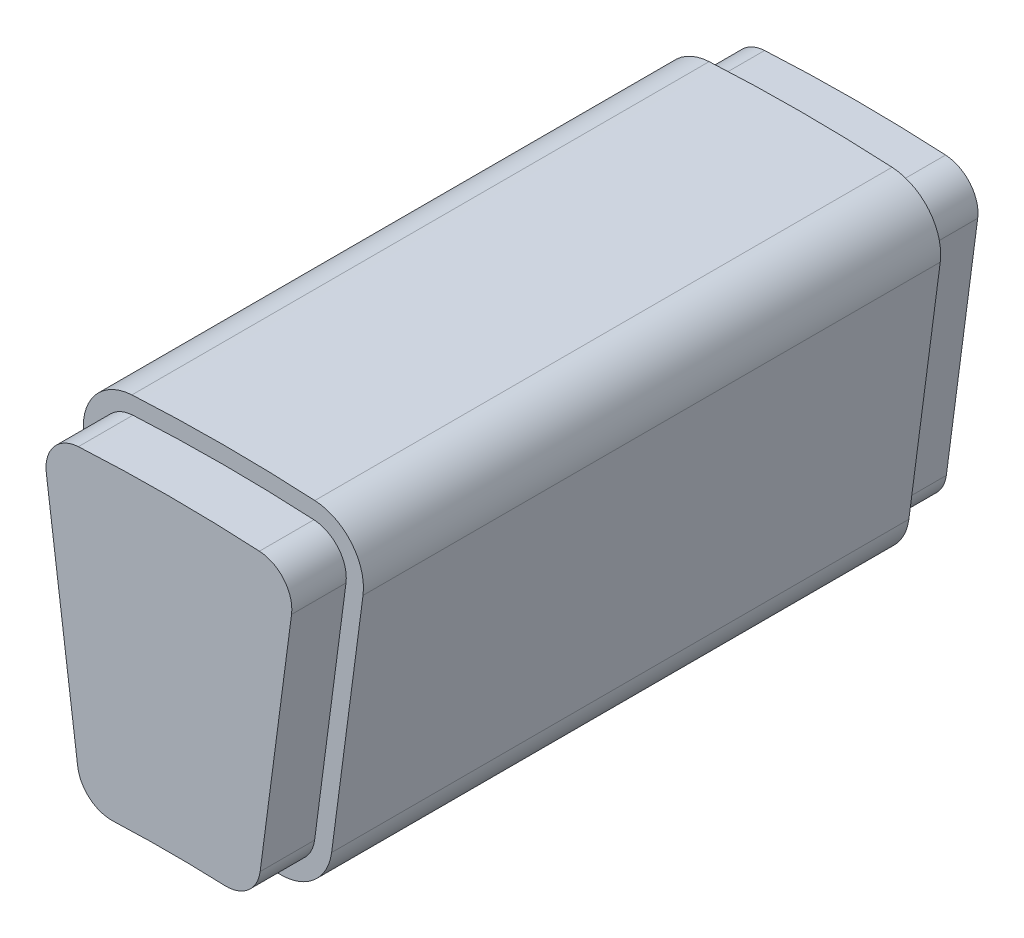
ISO-10303-21;
HEADER;
FILE_DESCRIPTION(('STEP AP214'),'2;1');
FILE_NAME('part.step','',(''),(''),'','','');
FILE_SCHEMA(('AUTOMOTIVE_DESIGN { 1 0 10303 214 1 1 1 1 }'));
ENDSEC;
DATA;
#1=APPLICATION_CONTEXT('core data for automotive mechanical design processes');
#2=APPLICATION_PROTOCOL_DEFINITION('international standard','automotive_design',2000,#1);
#3=PRODUCT_CONTEXT('',#1,'mechanical');
#4=PRODUCT('Part','Part','',(#3));
#5=PRODUCT_RELATED_PRODUCT_CATEGORY('part','',(#4));
#6=PRODUCT_DEFINITION_FORMATION('','',#4);
#7=PRODUCT_DEFINITION_CONTEXT('part definition',#1,'design');
#8=PRODUCT_DEFINITION('design','',#6,#7);
#9=PRODUCT_DEFINITION_SHAPE('','',#8);
#10=(LENGTH_UNIT() NAMED_UNIT(*) SI_UNIT(.MILLI.,.METRE.));
#11=(NAMED_UNIT(*) PLANE_ANGLE_UNIT() SI_UNIT($,.RADIAN.));
#12=(NAMED_UNIT(*) SI_UNIT($,.STERADIAN.) SOLID_ANGLE_UNIT());
#13=UNCERTAINTY_MEASURE_WITH_UNIT(LENGTH_MEASURE(1.E-05),#10,'distance_accuracy_value','');
#14=(GEOMETRIC_REPRESENTATION_CONTEXT(3) GLOBAL_UNCERTAINTY_ASSIGNED_CONTEXT((#13)) GLOBAL_UNIT_ASSIGNED_CONTEXT((#10,
#11,#12)) REPRESENTATION_CONTEXT('',''));
#15=CARTESIAN_POINT('',(0.,0.,0.));
#16=DIRECTION('',(0.,0.,1.));
#17=DIRECTION('',(1.,0.,0.));
#18=AXIS2_PLACEMENT_3D('',#15,#16,#17);
#19=CARTESIAN_POINT('',(5.16524875028588,92.8630424670149,-3.17499999999995));
#20=DIRECTION('',(0.,0.,1.));
#21=DIRECTION('',(1.,0.,0.));
#22=AXIS2_PLACEMENT_3D('',#19,#20,#21);
#23=CYLINDRICAL_SURFACE('',#22,2.00000000000001);
#24=CARTESIAN_POINT('',(5.16524875028588,92.8630424670149,33.65));
#25=DIRECTION('',(0.,0.,1.));
#26=DIRECTION('',(1.,0.,0.));
#27=AXIS2_PLACEMENT_3D('',#24,#25,#26);
#28=CIRCLE('',#27,2.00000000000001);
#29=CARTESIAN_POINT('',(5.27632150648806,94.8599557958376,33.65));
#30=VERTEX_POINT('',#29);
#31=CARTESIAN_POINT('',(7.1481384730335,92.6019900825748,33.65));
#32=VERTEX_POINT('',#31);
#33=EDGE_CURVE('E267',#30,#32,#28,.F.);
#34=ORIENTED_EDGE('',*,*,#33,.F.);
#35=DIRECTION('',(0.,0.,1.));
#36=VECTOR('',#35,1.);
#37=CARTESIAN_POINT('',(5.27632150648806,94.8599557958376,-3.17499999999995));
#38=LINE('',#37,#36);
#39=CARTESIAN_POINT('',(5.27632150648806,94.8599557958376,36.8250000000001));
#40=VERTEX_POINT('',#39);
#41=EDGE_CURVE('E318',#30,#40,#38,.T.);
#42=ORIENTED_EDGE('',*,*,#41,.T.);
#43=CARTESIAN_POINT('',(5.16524875028588,92.8630424670149,36.8250000000001));
#44=DIRECTION('',(0.,0.,1.));
#45=DIRECTION('',(1.,0.,0.));
#46=AXIS2_PLACEMENT_3D('',#43,#44,#45);
#47=CIRCLE('',#46,2.00000000000001);
#48=CARTESIAN_POINT('',(7.1481384730335,92.6019900825748,36.8250000000001));
#49=VERTEX_POINT('',#48);
#50=EDGE_CURVE('E270',#49,#40,#47,.T.);
#51=ORIENTED_EDGE('',*,*,#50,.F.);
#52=DIRECTION('',(0.,0.,1.));
#53=VECTOR('',#52,1.);
#54=CARTESIAN_POINT('',(7.1481384730335,92.6019900825748,-3.17499999999995));
#55=LINE('',#54,#53);
#56=EDGE_CURVE('E322',#32,#49,#55,.T.);
#57=ORIENTED_EDGE('',*,*,#56,.F.);
#58=EDGE_LOOP('',(#34,#42,#51,#57));
#59=FACE_BOUND('',#58,.T.);
#60=ADVANCED_FACE('F41',(#59),#23,.T.);
#61=CARTESIAN_POINT('',(5.31868012228188,78.705874290794,-3.17499999999995));
#62=DIRECTION('',(0.99144486137381,-0.130526192220052,0.));
#63=DIRECTION('',(0.130526192220052,0.99144486137381,0.));
#64=AXIS2_PLACEMENT_3D('',#61,#62,#63);
#65=PLANE('',#64);
#66=DIRECTION('',(-0.130526192220052,-0.99144486137381,0.));
#67=VECTOR('',#66,1.);
#68=CARTESIAN_POINT('',(5.31868012228188,78.705874290794,33.65));
#69=LINE('',#68,#67);
#70=CARTESIAN_POINT('',(5.31868012228188,78.705874290794,33.65));
#71=VERTEX_POINT('',#70);
#72=EDGE_CURVE('E55',#32,#71,#69,.T.);
#73=ORIENTED_EDGE('',*,*,#72,.F.);
#74=ORIENTED_EDGE('',*,*,#56,.T.);
#75=DIRECTION('',(0.130526192220052,0.99144486137381,0.));
#76=VECTOR('',#75,1.);
#77=CARTESIAN_POINT('',(5.31868012228188,78.705874290794,36.8250000000001));
#78=LINE('',#77,#76);
#79=CARTESIAN_POINT('',(5.31868012228188,78.705874290794,36.8250000000001));
#80=VERTEX_POINT('',#79);
#81=EDGE_CURVE('E291',#80,#49,#78,.T.);
#82=ORIENTED_EDGE('',*,*,#81,.F.);
#83=DIRECTION('',(0.,0.,1.));
#84=VECTOR('',#83,1.);
#85=CARTESIAN_POINT('',(5.31868012228188,78.705874290794,-3.17499999999995));
#86=LINE('',#85,#84);
#87=EDGE_CURVE('E326',#71,#80,#86,.T.);
#88=ORIENTED_EDGE('',*,*,#87,.F.);
#89=EDGE_LOOP('',(#73,#74,#82,#88));
#90=FACE_BOUND('',#89,.T.);
#91=ADVANCED_FACE('F451',(#90),#65,.T.);
#92=CARTESIAN_POINT('',(3.33579039953427,78.966926675234,-3.17499999999995));
#93=DIRECTION('',(0.,0.,1.));
#94=DIRECTION('',(1.,0.,0.));
#95=AXIS2_PLACEMENT_3D('',#92,#93,#94);
#96=CYLINDRICAL_SURFACE('',#95,1.99999999999999);
#97=CARTESIAN_POINT('',(3.33579039953427,78.966926675234,33.65));
#98=DIRECTION('',(0.,0.,1.));
#99=DIRECTION('',(1.,0.,0.));
#100=AXIS2_PLACEMENT_3D('',#97,#98,#99);
#101=CIRCLE('',#100,1.99999999999999);
#102=CARTESIAN_POINT('',(3.25137991976813,76.9687087514566,33.65));
#103=VERTEX_POINT('',#102);
#104=EDGE_CURVE('E63',#71,#103,#101,.F.);
#105=ORIENTED_EDGE('',*,*,#104,.F.);
#106=ORIENTED_EDGE('',*,*,#87,.T.);
#107=CARTESIAN_POINT('',(3.33579039953427,78.966926675234,36.8250000000001));
#108=DIRECTION('',(0.,0.,1.));
#109=DIRECTION('',(1.,0.,0.));
#110=AXIS2_PLACEMENT_3D('',#107,#108,#109);
#111=CIRCLE('',#110,1.99999999999999);
#112=CARTESIAN_POINT('',(3.25137991976813,76.9687087514566,36.8250000000001));
#113=VERTEX_POINT('',#112);
#114=EDGE_CURVE('E288',#113,#80,#111,.T.);
#115=ORIENTED_EDGE('',*,*,#114,.F.);
#116=DIRECTION('',(0.,0.,1.));
#117=VECTOR('',#116,1.);
#118=CARTESIAN_POINT('',(3.25137991976813,76.9687087514566,-3.17499999999995));
#119=LINE('',#118,#117);
#120=EDGE_CURVE('E330',#103,#113,#119,.T.);
#121=ORIENTED_EDGE('',*,*,#120,.F.);
#122=EDGE_LOOP('',(#105,#106,#115,#121));
#123=FACE_BOUND('',#122,.T.);
#124=ADVANCED_FACE('F457',(#123),#96,.T.);
#125=CARTESIAN_POINT('',(0.,0.,-3.17499999999995));
#126=DIRECTION('',(0.,0.,1.));
#127=DIRECTION('',(1.,0.,0.));
#128=AXIS2_PLACEMENT_3D('',#125,#126,#127);
#129=CYLINDRICAL_SURFACE('',#128,77.03735196805);
#130=CARTESIAN_POINT('',(0.,0.,33.65));
#131=DIRECTION('',(0.,0.,1.));
#132=DIRECTION('',(1.,0.,0.));
#133=AXIS2_PLACEMENT_3D('',#130,#131,#132);
#134=CIRCLE('',#133,77.03735196805);
#135=CARTESIAN_POINT('',(-3.25137991976813,76.9687087514566,33.65));
#136=VERTEX_POINT('',#135);
#137=EDGE_CURVE('E262',#103,#136,#134,.T.);
#138=ORIENTED_EDGE('',*,*,#137,.F.);
#139=ORIENTED_EDGE('',*,*,#120,.T.);
#140=CARTESIAN_POINT('',(0.,0.,36.8250000000001));
#141=DIRECTION('',(0.,0.,-1.));
#142=DIRECTION('',(1.,0.,0.));
#143=AXIS2_PLACEMENT_3D('',#140,#141,#142);
#144=CIRCLE('',#143,77.03735196805);
#145=CARTESIAN_POINT('',(-3.25137991976813,76.9687087514566,36.8250000000001));
#146=VERTEX_POINT('',#145);
#147=EDGE_CURVE('E285',#146,#113,#144,.T.);
#148=ORIENTED_EDGE('',*,*,#147,.F.);
#149=DIRECTION('',(0.,0.,1.));
#150=VECTOR('',#149,1.);
#151=CARTESIAN_POINT('',(-3.25137991976813,76.9687087514566,-3.17499999999995));
#152=LINE('',#151,#150);
#153=EDGE_CURVE('E334',#136,#146,#152,.T.);
#154=ORIENTED_EDGE('',*,*,#153,.F.);
#155=EDGE_LOOP('',(#138,#139,#148,#154));
#156=FACE_BOUND('',#155,.T.);
#157=ADVANCED_FACE('F472',(#156),#129,.F.);
#158=CARTESIAN_POINT('',(-3.33579039953427,78.9669266752341,-3.17499999999995));
#159=DIRECTION('',(0.,0.,1.));
#160=DIRECTION('',(1.,0.,0.));
#161=AXIS2_PLACEMENT_3D('',#158,#159,#160);
#162=CYLINDRICAL_SURFACE('',#161,2.00000000000001);
#163=CARTESIAN_POINT('',(-3.33579039953427,78.9669266752341,33.65));
#164=DIRECTION('',(0.,0.,1.));
#165=DIRECTION('',(1.,0.,0.));
#166=AXIS2_PLACEMENT_3D('',#163,#164,#165);
#167=CIRCLE('',#166,2.00000000000001);
#168=CARTESIAN_POINT('',(-5.3186801222819,78.705874290794,33.65));
#169=VERTEX_POINT('',#168);
#170=EDGE_CURVE('E259',#136,#169,#167,.F.);
#171=ORIENTED_EDGE('',*,*,#170,.F.);
#172=ORIENTED_EDGE('',*,*,#153,.T.);
#173=CARTESIAN_POINT('',(-3.33579039953427,78.9669266752341,36.8250000000001));
#174=DIRECTION('',(0.,0.,1.));
#175=DIRECTION('',(1.,0.,0.));
#176=AXIS2_PLACEMENT_3D('',#173,#174,#175);
#177=CIRCLE('',#176,2.00000000000001);
#178=CARTESIAN_POINT('',(-5.3186801222819,78.705874290794,36.8250000000001));
#179=VERTEX_POINT('',#178);
#180=EDGE_CURVE('E282',#179,#146,#177,.T.);
#181=ORIENTED_EDGE('',*,*,#180,.F.);
#182=DIRECTION('',(0.,0.,1.));
#183=VECTOR('',#182,1.);
#184=CARTESIAN_POINT('',(-5.3186801222819,78.705874290794,-3.17499999999995));
#185=LINE('',#184,#183);
#186=EDGE_CURVE('E338',#169,#179,#185,.T.);
#187=ORIENTED_EDGE('',*,*,#186,.F.);
#188=EDGE_LOOP('',(#171,#172,#181,#187));
#189=FACE_BOUND('',#188,.T.);
#190=ADVANCED_FACE('F475',(#189),#162,.T.);
#191=CARTESIAN_POINT('',(-7.1481384730335,92.6019900825748,-3.17499999999995));
#192=DIRECTION('',(-0.99144486137381,-0.130526192220052,0.));
#193=DIRECTION('',(0.130526192220052,-0.99144486137381,0.));
#194=AXIS2_PLACEMENT_3D('',#191,#192,#193);
#195=PLANE('',#194);
#196=DIRECTION('',(-0.130526192220052,0.99144486137381,0.));
#197=VECTOR('',#196,1.);
#198=CARTESIAN_POINT('',(-7.1481384730335,92.6019900825748,33.65));
#199=LINE('',#198,#197);
#200=CARTESIAN_POINT('',(-7.1481384730335,92.6019900825748,33.65));
#201=VERTEX_POINT('',#200);
#202=EDGE_CURVE('E256',#169,#201,#199,.T.);
#203=ORIENTED_EDGE('',*,*,#202,.F.);
#204=ORIENTED_EDGE('',*,*,#186,.T.);
#205=DIRECTION('',(0.130526192220052,-0.99144486137381,0.));
#206=VECTOR('',#205,1.);
#207=CARTESIAN_POINT('',(-7.1481384730335,92.6019900825748,36.8250000000001));
#208=LINE('',#207,#206);
#209=CARTESIAN_POINT('',(-7.1481384730335,92.6019900825748,36.8250000000001));
#210=VERTEX_POINT('',#209);
#211=EDGE_CURVE('E279',#210,#179,#208,.T.);
#212=ORIENTED_EDGE('',*,*,#211,.F.);
#213=DIRECTION('',(0.,0.,1.));
#214=VECTOR('',#213,1.);
#215=CARTESIAN_POINT('',(-7.1481384730335,92.6019900825748,-3.17499999999995));
#216=LINE('',#215,#214);
#217=EDGE_CURVE('E342',#201,#210,#216,.T.);
#218=ORIENTED_EDGE('',*,*,#217,.F.);
#219=EDGE_LOOP('',(#203,#204,#212,#218));
#220=FACE_BOUND('',#219,.T.);
#221=ADVANCED_FACE('F479',(#220),#195,.T.);
#222=CARTESIAN_POINT('',(-5.16524875028588,92.8630424670149,-3.17499999999995));
#223=DIRECTION('',(0.,0.,1.));
#224=DIRECTION('',(1.,0.,0.));
#225=AXIS2_PLACEMENT_3D('',#222,#223,#224);
#226=CYLINDRICAL_SURFACE('',#225,1.99999999999999);
#227=CARTESIAN_POINT('',(-5.16524875028588,92.8630424670149,33.65));
#228=DIRECTION('',(0.,0.,1.));
#229=DIRECTION('',(1.,0.,0.));
#230=AXIS2_PLACEMENT_3D('',#227,#228,#229);
#231=CIRCLE('',#230,1.99999999999999);
#232=CARTESIAN_POINT('',(-5.27632150648805,94.8599557958376,33.65));
#233=VERTEX_POINT('',#232);
#234=EDGE_CURVE('E253',#201,#233,#231,.F.);
#235=ORIENTED_EDGE('',*,*,#234,.F.);
#236=ORIENTED_EDGE('',*,*,#217,.T.);
#237=CARTESIAN_POINT('',(-5.16524875028588,92.8630424670149,36.8250000000001));
#238=DIRECTION('',(0.,0.,1.));
#239=DIRECTION('',(1.,0.,0.));
#240=AXIS2_PLACEMENT_3D('',#237,#238,#239);
#241=CIRCLE('',#240,1.99999999999999);
#242=CARTESIAN_POINT('',(-5.27632150648805,94.8599557958376,36.8250000000001));
#243=VERTEX_POINT('',#242);
#244=EDGE_CURVE('E276',#243,#210,#241,.T.);
#245=ORIENTED_EDGE('',*,*,#244,.F.);
#246=DIRECTION('',(0.,0.,1.));
#247=VECTOR('',#246,1.);
#248=CARTESIAN_POINT('',(-5.27632150648805,94.8599557958376,-3.17499999999995));
#249=LINE('',#248,#247);
#250=EDGE_CURVE('E346',#233,#243,#249,.T.);
#251=ORIENTED_EDGE('',*,*,#250,.F.);
#252=EDGE_LOOP('',(#235,#236,#245,#251));
#253=FACE_BOUND('',#252,.T.);
#254=ADVANCED_FACE('F483',(#253),#226,.T.);
#255=CARTESIAN_POINT('',(0.,0.,-3.17499999999995));
#256=DIRECTION('',(0.,0.,1.));
#257=DIRECTION('',(1.,0.,0.));
#258=AXIS2_PLACEMENT_3D('',#255,#256,#257);
#259=CYLINDRICAL_SURFACE('',#258,95.0065828362861);
#260=CARTESIAN_POINT('',(0.,0.,33.65));
#261=DIRECTION('',(0.,0.,1.));
#262=DIRECTION('',(1.,0.,0.));
#263=AXIS2_PLACEMENT_3D('',#260,#261,#262);
#264=CIRCLE('',#263,95.0065828362861);
#265=EDGE_CURVE('E11',#233,#30,#264,.F.);
#266=ORIENTED_EDGE('',*,*,#265,.F.);
#267=ORIENTED_EDGE('',*,*,#250,.T.);
#268=CARTESIAN_POINT('',(0.,0.,36.8250000000001));
#269=DIRECTION('',(0.,0.,1.));
#270=DIRECTION('',(1.,0.,0.));
#271=AXIS2_PLACEMENT_3D('',#268,#269,#270);
#272=CIRCLE('',#271,95.0065828362861);
#273=EDGE_CURVE('E273',#40,#243,#272,.T.);
#274=ORIENTED_EDGE('',*,*,#273,.F.);
#275=ORIENTED_EDGE('',*,*,#41,.F.);
#276=EDGE_LOOP('',(#266,#267,#274,#275));
#277=FACE_BOUND('',#276,.T.);
#278=ADVANCED_FACE('F486',(#277),#259,.T.);
#279=CARTESIAN_POINT('',(5.16524875028588,92.8630424670149,36.8250000000001));
#280=DIRECTION('',(0.,0.,1.));
#281=DIRECTION('',(1.,0.,0.));
#282=AXIS2_PLACEMENT_3D('',#279,#280,#281);
#283=PLANE('',#282);
#284=ORIENTED_EDGE('',*,*,#50,.T.);
#285=ORIENTED_EDGE('',*,*,#273,.T.);
#286=ORIENTED_EDGE('',*,*,#244,.T.);
#287=ORIENTED_EDGE('',*,*,#211,.T.);
#288=ORIENTED_EDGE('',*,*,#180,.T.);
#289=ORIENTED_EDGE('',*,*,#147,.T.);
#290=ORIENTED_EDGE('',*,*,#114,.T.);
#291=ORIENTED_EDGE('',*,*,#81,.T.);
#292=EDGE_LOOP('',(#284,#285,#286,#287,#288,#289,#290,#291));
#293=FACE_BOUND('',#292,.T.);
#294=ADVANCED_FACE('F489',(#293),#283,.T.);
#295=CARTESIAN_POINT('',(5.16524875028588,92.8630424670149,33.65));
#296=DIRECTION('',(0.,0.,-1.));
#297=DIRECTION('',(-1.,0.,0.));
#298=AXIS2_PLACEMENT_3D('',#295,#296,#297);
#299=CYLINDRICAL_SURFACE('',#298,3.00000000000001);
#300=CARTESIAN_POINT('',(5.16524875028588,92.8630424670149,0.));
#301=DIRECTION('',(0.,0.,1.));
#302=DIRECTION('',(1.,0.,0.));
#303=AXIS2_PLACEMENT_3D('',#300,#301,#302);
#304=CIRCLE('',#303,3.00000000000001);
#305=CARTESIAN_POINT('',(8.13958333440732,92.4714638903548,0.));
#306=VERTEX_POINT('',#305);
#307=CARTESIAN_POINT('',(5.33185788458914,95.8584124602489,0.));
#308=VERTEX_POINT('',#307);
#309=EDGE_CURVE('E226',#306,#308,#304,.T.);
#310=ORIENTED_EDGE('',*,*,#309,.T.);
#311=DIRECTION('',(0.,0.,-1.));
#312=VECTOR('',#311,1.);
#313=CARTESIAN_POINT('',(5.33185788458914,95.8584124602489,33.65));
#314=LINE('',#313,#312);
#315=CARTESIAN_POINT('',(5.33185788458914,95.8584124602489,33.65));
#316=VERTEX_POINT('',#315);
#317=EDGE_CURVE('E206',#316,#308,#314,.T.);
#318=ORIENTED_EDGE('',*,*,#317,.F.);
#319=CARTESIAN_POINT('',(5.16524875028588,92.8630424670149,33.65));
#320=DIRECTION('',(0.,0.,1.));
#321=DIRECTION('',(1.,0.,0.));
#322=AXIS2_PLACEMENT_3D('',#319,#320,#321);
#323=CIRCLE('',#322,3.00000000000001);
#324=CARTESIAN_POINT('',(8.13958333440732,92.4714638903548,33.65));
#325=VERTEX_POINT('',#324);
#326=EDGE_CURVE('E213',#325,#316,#323,.T.);
#327=ORIENTED_EDGE('',*,*,#326,.F.);
#328=DIRECTION('',(0.,0.,-1.));
#329=VECTOR('',#328,1.);
#330=CARTESIAN_POINT('',(8.13958333440732,92.4714638903548,33.65));
#331=LINE('',#330,#329);
#332=EDGE_CURVE('E401',#325,#306,#331,.T.);
#333=ORIENTED_EDGE('',*,*,#332,.T.);
#334=EDGE_LOOP('',(#310,#318,#327,#333));
#335=FACE_BOUND('',#334,.T.);
#336=ADVANCED_FACE('F224',(#335),#299,.T.);
#337=CARTESIAN_POINT('',(0.,0.,33.65));
#338=DIRECTION('',(0.,0.,-1.));
#339=DIRECTION('',(-1.,0.,0.));
#340=AXIS2_PLACEMENT_3D('',#337,#338,#339);
#341=CYLINDRICAL_SURFACE('',#340,96.0065828362861);
#342=CARTESIAN_POINT('',(0.,0.,0.));
#343=DIRECTION('',(0.,0.,1.));
#344=DIRECTION('',(1.,0.,0.));
#345=AXIS2_PLACEMENT_3D('',#342,#343,#344);
#346=CIRCLE('',#345,96.0065828362861);
#347=CARTESIAN_POINT('',(-5.33185788458912,95.8584124602489,0.));
#348=VERTEX_POINT('',#347);
#349=EDGE_CURVE('E384',#308,#348,#346,.T.);
#350=ORIENTED_EDGE('',*,*,#349,.T.);
#351=DIRECTION('',(0.,0.,-1.));
#352=VECTOR('',#351,1.);
#353=CARTESIAN_POINT('',(-5.33185788458912,95.8584124602489,33.65));
#354=LINE('',#353,#352);
#355=CARTESIAN_POINT('',(-5.33185788458912,95.8584124602489,33.65));
#356=VERTEX_POINT('',#355);
#357=EDGE_CURVE('E209',#356,#348,#354,.T.);
#358=ORIENTED_EDGE('',*,*,#357,.F.);
#359=CARTESIAN_POINT('',(0.,0.,33.65));
#360=DIRECTION('',(0.,0.,1.));
#361=DIRECTION('',(1.,0.,0.));
#362=AXIS2_PLACEMENT_3D('',#359,#360,#361);
#363=CIRCLE('',#362,96.0065828362861);
#364=EDGE_CURVE('E202',#316,#356,#363,.T.);
#365=ORIENTED_EDGE('',*,*,#364,.F.);
#366=ORIENTED_EDGE('',*,*,#317,.T.);
#367=EDGE_LOOP('',(#350,#358,#365,#366));
#368=FACE_BOUND('',#367,.T.);
#369=ADVANCED_FACE('F204',(#368),#341,.T.);
#370=CARTESIAN_POINT('',(-5.16524875028588,92.8630424670149,33.65));
#371=DIRECTION('',(0.,0.,-1.));
#372=DIRECTION('',(-1.,0.,0.));
#373=AXIS2_PLACEMENT_3D('',#370,#371,#372);
#374=CYLINDRICAL_SURFACE('',#373,2.99999999999999);
#375=CARTESIAN_POINT('',(-5.16524875028588,92.8630424670149,0.));
#376=DIRECTION('',(0.,0.,1.));
#377=DIRECTION('',(1.,0.,0.));
#378=AXIS2_PLACEMENT_3D('',#375,#376,#377);
#379=CIRCLE('',#378,2.99999999999999);
#380=CARTESIAN_POINT('',(-8.1395833344073,92.4714638903548,0.));
#381=VERTEX_POINT('',#380);
#382=EDGE_CURVE('E386',#348,#381,#379,.T.);
#383=ORIENTED_EDGE('',*,*,#382,.T.);
#384=DIRECTION('',(0.,0.,-1.));
#385=VECTOR('',#384,1.);
#386=CARTESIAN_POINT('',(-8.1395833344073,92.4714638903548,33.65));
#387=LINE('',#386,#385);
#388=CARTESIAN_POINT('',(-8.1395833344073,92.4714638903548,33.65));
#389=VERTEX_POINT('',#388);
#390=EDGE_CURVE('E232',#389,#381,#387,.T.);
#391=ORIENTED_EDGE('',*,*,#390,.F.);
#392=CARTESIAN_POINT('',(-5.16524875028588,92.8630424670149,33.65));
#393=DIRECTION('',(0.,0.,1.));
#394=DIRECTION('',(1.,0.,0.));
#395=AXIS2_PLACEMENT_3D('',#392,#393,#394);
#396=CIRCLE('',#395,2.99999999999999);
#397=EDGE_CURVE('E212',#356,#389,#396,.T.);
#398=ORIENTED_EDGE('',*,*,#397,.F.);
#399=ORIENTED_EDGE('',*,*,#357,.T.);
#400=EDGE_LOOP('',(#383,#391,#398,#399));
#401=FACE_BOUND('',#400,.T.);
#402=ADVANCED_FACE('F441',(#401),#374,.T.);
#403=CARTESIAN_POINT('',(-8.1395833344073,92.4714638903548,33.65));
#404=DIRECTION('',(0.99144486137381,0.130526192220051,0.));
#405=DIRECTION('',(-0.130526192220051,0.99144486137381,0.));
#406=AXIS2_PLACEMENT_3D('',#403,#404,#405);
#407=PLANE('',#406);
#408=DIRECTION('',(0.130526192220051,-0.99144486137381,0.));
#409=VECTOR('',#408,1.);
#410=CARTESIAN_POINT('',(-8.1395833344073,92.4714638903548,0.));
#411=LINE('',#410,#409);
#412=CARTESIAN_POINT('',(-6.31012498365571,78.5753480985739,0.));
#413=VERTEX_POINT('',#412);
#414=EDGE_CURVE('E392',#381,#413,#411,.T.);
#415=ORIENTED_EDGE('',*,*,#414,.T.);
#416=DIRECTION('',(0.,0.,-1.));
#417=VECTOR('',#416,1.);
#418=CARTESIAN_POINT('',(-6.31012498365571,78.5753480985739,33.65));
#419=LINE('',#418,#417);
#420=CARTESIAN_POINT('',(-6.31012498365571,78.5753480985739,33.65));
#421=VERTEX_POINT('',#420);
#422=EDGE_CURVE('E412',#421,#413,#419,.T.);
#423=ORIENTED_EDGE('',*,*,#422,.F.);
#424=DIRECTION('',(0.130526192220051,-0.99144486137381,0.));
#425=VECTOR('',#424,1.);
#426=CARTESIAN_POINT('',(-8.1395833344073,92.4714638903548,33.65));
#427=LINE('',#426,#425);
#428=EDGE_CURVE('E421',#389,#421,#427,.T.);
#429=ORIENTED_EDGE('',*,*,#428,.F.);
#430=ORIENTED_EDGE('',*,*,#390,.T.);
#431=EDGE_LOOP('',(#415,#423,#429,#430));
#432=FACE_BOUND('',#431,.T.);
#433=ADVANCED_FACE('F419',(#432),#407,.F.);
#434=CARTESIAN_POINT('',(-3.33579039953427,78.9669266752341,33.65));
#435=DIRECTION('',(0.,0.,-1.));
#436=DIRECTION('',(-1.,0.,0.));
#437=AXIS2_PLACEMENT_3D('',#434,#435,#436);
#438=CYLINDRICAL_SURFACE('',#437,3.00000000000001);
#439=CARTESIAN_POINT('',(-3.33579039953427,78.9669266752341,0.));
#440=DIRECTION('',(0.,0.,1.));
#441=DIRECTION('',(1.,0.,0.));
#442=AXIS2_PLACEMENT_3D('',#439,#440,#441);
#443=CIRCLE('',#442,3.00000000000001);
#444=CARTESIAN_POINT('',(-3.20917467988506,75.9695997895678,0.));
#445=VERTEX_POINT('',#444);
#446=EDGE_CURVE('E394',#413,#445,#443,.T.);
#447=ORIENTED_EDGE('',*,*,#446,.T.);
#448=DIRECTION('',(0.,0.,-1.));
#449=VECTOR('',#448,1.);
#450=CARTESIAN_POINT('',(-3.20917467988506,75.9695997895678,33.65));
#451=LINE('',#450,#449);
#452=CARTESIAN_POINT('',(-3.20917467988506,75.9695997895678,33.65));
#453=VERTEX_POINT('',#452);
#454=EDGE_CURVE('E409',#453,#445,#451,.T.);
#455=ORIENTED_EDGE('',*,*,#454,.F.);
#456=CARTESIAN_POINT('',(-3.33579039953427,78.9669266752341,33.65));
#457=DIRECTION('',(0.,0.,1.));
#458=DIRECTION('',(1.,0.,0.));
#459=AXIS2_PLACEMENT_3D('',#456,#457,#458);
#460=CIRCLE('',#459,3.00000000000001);
#461=EDGE_CURVE('E436',#421,#453,#460,.T.);
#462=ORIENTED_EDGE('',*,*,#461,.F.);
#463=ORIENTED_EDGE('',*,*,#422,.T.);
#464=EDGE_LOOP('',(#447,#455,#462,#463));
#465=FACE_BOUND('',#464,.T.);
#466=ADVANCED_FACE('F427',(#465),#438,.T.);
#467=CARTESIAN_POINT('',(0.,0.,33.65));
#468=DIRECTION('',(0.,0.,-1.));
#469=DIRECTION('',(-1.,0.,0.));
#470=AXIS2_PLACEMENT_3D('',#467,#468,#469);
#471=CYLINDRICAL_SURFACE('',#470,76.03735196805);
#472=CARTESIAN_POINT('',(0.,0.,0.));
#473=DIRECTION('',(0.,0.,-1.));
#474=DIRECTION('',(1.,0.,0.));
#475=AXIS2_PLACEMENT_3D('',#472,#473,#474);
#476=CIRCLE('',#475,76.03735196805);
#477=CARTESIAN_POINT('',(3.20917467988506,75.9695997895678,0.));
#478=VERTEX_POINT('',#477);
#479=EDGE_CURVE('E396',#445,#478,#476,.T.);
#480=ORIENTED_EDGE('',*,*,#479,.T.);
#481=DIRECTION('',(0.,0.,-1.));
#482=VECTOR('',#481,1.);
#483=CARTESIAN_POINT('',(3.20917467988506,75.9695997895678,33.65));
#484=LINE('',#483,#482);
#485=CARTESIAN_POINT('',(3.20917467988506,75.9695997895678,33.65));
#486=VERTEX_POINT('',#485);
#487=EDGE_CURVE('E406',#486,#478,#484,.T.);
#488=ORIENTED_EDGE('',*,*,#487,.F.);
#489=CARTESIAN_POINT('',(0.,0.,33.65));
#490=DIRECTION('',(0.,0.,-1.));
#491=DIRECTION('',(1.,0.,0.));
#492=AXIS2_PLACEMENT_3D('',#489,#490,#491);
#493=CIRCLE('',#492,76.03735196805);
#494=EDGE_CURVE('E433',#453,#486,#493,.T.);
#495=ORIENTED_EDGE('',*,*,#494,.F.);
#496=ORIENTED_EDGE('',*,*,#454,.T.);
#497=EDGE_LOOP('',(#480,#488,#495,#496));
#498=FACE_BOUND('',#497,.T.);
#499=ADVANCED_FACE('F431',(#498),#471,.F.);
#500=CARTESIAN_POINT('',(3.33579039953427,78.966926675234,33.65));
#501=DIRECTION('',(0.,0.,-1.));
#502=DIRECTION('',(-1.,0.,0.));
#503=AXIS2_PLACEMENT_3D('',#500,#501,#502);
#504=CYLINDRICAL_SURFACE('',#503,2.99999999999998);
#505=CARTESIAN_POINT('',(3.33579039953427,78.966926675234,0.));
#506=DIRECTION('',(0.,0.,1.));
#507=DIRECTION('',(1.,0.,0.));
#508=AXIS2_PLACEMENT_3D('',#505,#506,#507);
#509=CIRCLE('',#508,2.99999999999998);
#510=CARTESIAN_POINT('',(6.31012498365569,78.5753480985739,0.));
#511=VERTEX_POINT('',#510);
#512=EDGE_CURVE('E398',#478,#511,#509,.T.);
#513=ORIENTED_EDGE('',*,*,#512,.T.);
#514=DIRECTION('',(0.,0.,-1.));
#515=VECTOR('',#514,1.);
#516=CARTESIAN_POINT('',(6.31012498365569,78.5753480985739,33.65));
#517=LINE('',#516,#515);
#518=CARTESIAN_POINT('',(6.31012498365569,78.5753480985739,33.65));
#519=VERTEX_POINT('',#518);
#520=EDGE_CURVE('E403',#519,#511,#517,.T.);
#521=ORIENTED_EDGE('',*,*,#520,.F.);
#522=CARTESIAN_POINT('',(3.33579039953427,78.966926675234,33.65));
#523=DIRECTION('',(0.,0.,1.));
#524=DIRECTION('',(1.,0.,0.));
#525=AXIS2_PLACEMENT_3D('',#522,#523,#524);
#526=CIRCLE('',#525,2.99999999999998);
#527=EDGE_CURVE('E435',#486,#519,#526,.T.);
#528=ORIENTED_EDGE('',*,*,#527,.F.);
#529=ORIENTED_EDGE('',*,*,#487,.T.);
#530=EDGE_LOOP('',(#513,#521,#528,#529));
#531=FACE_BOUND('',#530,.T.);
#532=ADVANCED_FACE('F588',(#531),#504,.T.);
#533=CARTESIAN_POINT('',(6.31012498365569,78.5753480985739,33.65));
#534=DIRECTION('',(-0.99144486137381,0.130526192220054,0.));
#535=DIRECTION('',(-0.130526192220054,-0.99144486137381,0.));
#536=AXIS2_PLACEMENT_3D('',#533,#534,#535);
#537=PLANE('',#536);
#538=DIRECTION('',(0.130526192220054,0.99144486137381,0.));
#539=VECTOR('',#538,1.);
#540=CARTESIAN_POINT('',(6.31012498365569,78.5753480985739,0.));
#541=LINE('',#540,#539);
#542=EDGE_CURVE('E222',#511,#306,#541,.T.);
#543=ORIENTED_EDGE('',*,*,#542,.T.);
#544=ORIENTED_EDGE('',*,*,#332,.F.);
#545=DIRECTION('',(0.130526192220054,0.99144486137381,0.));
#546=VECTOR('',#545,1.);
#547=CARTESIAN_POINT('',(6.31012498365569,78.5753480985739,33.65));
#548=LINE('',#547,#546);
#549=EDGE_CURVE('E218',#519,#325,#548,.T.);
#550=ORIENTED_EDGE('',*,*,#549,.F.);
#551=ORIENTED_EDGE('',*,*,#520,.T.);
#552=EDGE_LOOP('',(#543,#544,#550,#551));
#553=FACE_BOUND('',#552,.T.);
#554=ADVANCED_FACE('F597',(#553),#537,.F.);
#555=CARTESIAN_POINT('',(5.16524875028588,92.8630424670149,33.65));
#556=DIRECTION('',(0.,0.,1.));
#557=DIRECTION('',(1.,0.,0.));
#558=AXIS2_PLACEMENT_3D('',#555,#556,#557);
#559=PLANE('',#558);
#560=ORIENTED_EDGE('',*,*,#265,.T.);
#561=ORIENTED_EDGE('',*,*,#33,.T.);
#562=ORIENTED_EDGE('',*,*,#72,.T.);
#563=ORIENTED_EDGE('',*,*,#104,.T.);
#564=ORIENTED_EDGE('',*,*,#137,.T.);
#565=ORIENTED_EDGE('',*,*,#170,.T.);
#566=ORIENTED_EDGE('',*,*,#202,.T.);
#567=ORIENTED_EDGE('',*,*,#234,.T.);
#568=EDGE_LOOP('',(#560,#561,#562,#563,#564,#565,#566,#567));
#569=FACE_BOUND('',#568,.T.);
#570=ORIENTED_EDGE('',*,*,#326,.T.);
#571=ORIENTED_EDGE('',*,*,#364,.T.);
#572=ORIENTED_EDGE('',*,*,#397,.T.);
#573=ORIENTED_EDGE('',*,*,#428,.T.);
#574=ORIENTED_EDGE('',*,*,#461,.T.);
#575=ORIENTED_EDGE('',*,*,#494,.T.);
#576=ORIENTED_EDGE('',*,*,#527,.T.);
#577=ORIENTED_EDGE('',*,*,#549,.T.);
#578=EDGE_LOOP('',(#570,#571,#572,#573,#574,#575,#576,#577));
#579=FACE_BOUND('',#578,.T.);
#580=ADVANCED_FACE('F216',(#569,#579),#559,.T.);
#581=CARTESIAN_POINT('',(5.16524875028588,92.8630424670149,0.));
#582=DIRECTION('',(0.,0.,1.));
#583=DIRECTION('',(1.,0.,0.));
#584=AXIS2_PLACEMENT_3D('',#581,#582,#583);
#585=PLANE('',#584);
#586=CARTESIAN_POINT('',(5.16524875028588,92.8630424670149,0.));
#587=DIRECTION('',(0.,0.,1.));
#588=DIRECTION('',(1.,0.,0.));
#589=AXIS2_PLACEMENT_3D('',#586,#587,#588);
#590=CIRCLE('',#589,2.00000000000001);
#591=CARTESIAN_POINT('',(5.27632150648806,94.8599557958376,0.));
#592=VERTEX_POINT('',#591);
#593=CARTESIAN_POINT('',(7.1481384730335,92.6019900825748,0.));
#594=VERTEX_POINT('',#593);
#595=EDGE_CURVE('E250',#592,#594,#590,.F.);
#596=ORIENTED_EDGE('',*,*,#595,.F.);
#597=CARTESIAN_POINT('',(0.,0.,0.));
#598=DIRECTION('',(0.,0.,1.));
#599=DIRECTION('',(1.,0.,0.));
#600=AXIS2_PLACEMENT_3D('',#597,#598,#599);
#601=CIRCLE('',#600,95.0065828362861);
#602=CARTESIAN_POINT('',(-5.27632150648805,94.8599557958376,0.));
#603=VERTEX_POINT('',#602);
#604=EDGE_CURVE('E48',#603,#592,#601,.F.);
#605=ORIENTED_EDGE('',*,*,#604,.F.);
#606=CARTESIAN_POINT('',(-5.16524875028588,92.8630424670149,0.));
#607=DIRECTION('',(0.,0.,1.));
#608=DIRECTION('',(1.,0.,0.));
#609=AXIS2_PLACEMENT_3D('',#606,#607,#608);
#610=CIRCLE('',#609,1.99999999999999);
#611=CARTESIAN_POINT('',(-7.14813847303349,92.6019900825748,0.));
#612=VERTEX_POINT('',#611);
#613=EDGE_CURVE('E227',#612,#603,#610,.F.);
#614=ORIENTED_EDGE('',*,*,#613,.F.);
#615=DIRECTION('',(-0.130526192220052,0.99144486137381,0.));
#616=VECTOR('',#615,1.);
#617=CARTESIAN_POINT('',(-7.1481384730335,92.6019900825748,0.));
#618=LINE('',#617,#616);
#619=CARTESIAN_POINT('',(-5.3186801222819,78.705874290794,0.));
#620=VERTEX_POINT('',#619);
#621=EDGE_CURVE('E230',#620,#612,#618,.T.);
#622=ORIENTED_EDGE('',*,*,#621,.F.);
#623=CARTESIAN_POINT('',(-3.33579039953427,78.9669266752341,0.));
#624=DIRECTION('',(0.,0.,1.));
#625=DIRECTION('',(1.,0.,0.));
#626=AXIS2_PLACEMENT_3D('',#623,#624,#625);
#627=CIRCLE('',#626,2.00000000000001);
#628=CARTESIAN_POINT('',(-3.25137991976813,76.9687087514566,0.));
#629=VERTEX_POINT('',#628);
#630=EDGE_CURVE('E238',#629,#620,#627,.F.);
#631=ORIENTED_EDGE('',*,*,#630,.F.);
#632=CARTESIAN_POINT('',(0.,0.,0.));
#633=DIRECTION('',(0.,0.,1.));
#634=DIRECTION('',(1.,0.,0.));
#635=AXIS2_PLACEMENT_3D('',#632,#633,#634);
#636=CIRCLE('',#635,77.03735196805);
#637=CARTESIAN_POINT('',(3.25137991976813,76.9687087514566,0.));
#638=VERTEX_POINT('',#637);
#639=EDGE_CURVE('E241',#638,#629,#636,.T.);
#640=ORIENTED_EDGE('',*,*,#639,.F.);
#641=CARTESIAN_POINT('',(3.33579039953427,78.966926675234,0.));
#642=DIRECTION('',(0.,0.,1.));
#643=DIRECTION('',(1.,0.,0.));
#644=AXIS2_PLACEMENT_3D('',#641,#642,#643);
#645=CIRCLE('',#644,1.99999999999999);
#646=CARTESIAN_POINT('',(5.31868012228188,78.705874290794,0.));
#647=VERTEX_POINT('',#646);
#648=EDGE_CURVE('E244',#647,#638,#645,.F.);
#649=ORIENTED_EDGE('',*,*,#648,.F.);
#650=DIRECTION('',(-0.130526192220052,-0.99144486137381,0.));
#651=VECTOR('',#650,1.);
#652=CARTESIAN_POINT('',(5.31868012228188,78.705874290794,0.));
#653=LINE('',#652,#651);
#654=EDGE_CURVE('E247',#594,#647,#653,.T.);
#655=ORIENTED_EDGE('',*,*,#654,.F.);
#656=EDGE_LOOP('',(#596,#605,#614,#622,#631,#640,#649,#655));
#657=FACE_BOUND('',#656,.T.);
#658=ORIENTED_EDGE('',*,*,#309,.F.);
#659=ORIENTED_EDGE('',*,*,#542,.F.);
#660=ORIENTED_EDGE('',*,*,#512,.F.);
#661=ORIENTED_EDGE('',*,*,#479,.F.);
#662=ORIENTED_EDGE('',*,*,#446,.F.);
#663=ORIENTED_EDGE('',*,*,#414,.F.);
#664=ORIENTED_EDGE('',*,*,#382,.F.);
#665=ORIENTED_EDGE('',*,*,#349,.F.);
#666=EDGE_LOOP('',(#658,#659,#660,#661,#662,#663,#664,#665));
#667=FACE_BOUND('',#666,.T.);
#668=ADVANCED_FACE('F377',(#657,#667),#585,.F.);
#669=CARTESIAN_POINT('',(5.16524875028588,92.8630424670149,-3.17499999999995));
#670=DIRECTION('',(0.,0.,1.));
#671=DIRECTION('',(1.,0.,0.));
#672=AXIS2_PLACEMENT_3D('',#669,#670,#671);
#673=PLANE('',#672);
#674=CARTESIAN_POINT('',(5.16524875028588,92.8630424670149,-3.17499999999995));
#675=DIRECTION('',(0.,0.,1.));
#676=DIRECTION('',(1.,0.,0.));
#677=AXIS2_PLACEMENT_3D('',#674,#675,#676);
#678=CIRCLE('',#677,2.00000000000001);
#679=CARTESIAN_POINT('',(7.1481384730335,92.6019900825748,-3.17499999999995));
#680=VERTEX_POINT('',#679);
#681=CARTESIAN_POINT('',(5.27632150648806,94.8599557958376,-3.17499999999995));
#682=VERTEX_POINT('',#681);
#683=EDGE_CURVE('E294',#680,#682,#678,.T.);
#684=ORIENTED_EDGE('',*,*,#683,.F.);
#685=DIRECTION('',(0.130526192220052,0.99144486137381,0.));
#686=VECTOR('',#685,1.);
#687=CARTESIAN_POINT('',(5.31868012228188,78.705874290794,-3.17499999999995));
#688=LINE('',#687,#686);
#689=CARTESIAN_POINT('',(5.31868012228188,78.705874290794,-3.17499999999995));
#690=VERTEX_POINT('',#689);
#691=EDGE_CURVE('E315',#690,#680,#688,.T.);
#692=ORIENTED_EDGE('',*,*,#691,.F.);
#693=CARTESIAN_POINT('',(3.33579039953427,78.966926675234,-3.17499999999995));
#694=DIRECTION('',(0.,0.,1.));
#695=DIRECTION('',(1.,0.,0.));
#696=AXIS2_PLACEMENT_3D('',#693,#694,#695);
#697=CIRCLE('',#696,1.99999999999999);
#698=CARTESIAN_POINT('',(3.25137991976813,76.9687087514566,-3.17499999999995));
#699=VERTEX_POINT('',#698);
#700=EDGE_CURVE('E312',#699,#690,#697,.T.);
#701=ORIENTED_EDGE('',*,*,#700,.F.);
#702=CARTESIAN_POINT('',(0.,0.,-3.17499999999995));
#703=DIRECTION('',(0.,0.,-1.));
#704=DIRECTION('',(1.,0.,0.));
#705=AXIS2_PLACEMENT_3D('',#702,#703,#704);
#706=CIRCLE('',#705,77.03735196805);
#707=CARTESIAN_POINT('',(-3.25137991976813,76.9687087514566,-3.17499999999995));
#708=VERTEX_POINT('',#707);
#709=EDGE_CURVE('E309',#708,#699,#706,.T.);
#710=ORIENTED_EDGE('',*,*,#709,.F.);
#711=CARTESIAN_POINT('',(-3.33579039953427,78.9669266752341,-3.17499999999995));
#712=DIRECTION('',(0.,0.,1.));
#713=DIRECTION('',(1.,0.,0.));
#714=AXIS2_PLACEMENT_3D('',#711,#712,#713);
#715=CIRCLE('',#714,2.00000000000001);
#716=CARTESIAN_POINT('',(-5.3186801222819,78.705874290794,-3.17499999999995));
#717=VERTEX_POINT('',#716);
#718=EDGE_CURVE('E306',#717,#708,#715,.T.);
#719=ORIENTED_EDGE('',*,*,#718,.F.);
#720=DIRECTION('',(0.130526192220052,-0.99144486137381,0.));
#721=VECTOR('',#720,1.);
#722=CARTESIAN_POINT('',(-7.1481384730335,92.6019900825748,-3.17499999999995));
#723=LINE('',#722,#721);
#724=CARTESIAN_POINT('',(-7.1481384730335,92.6019900825748,-3.17499999999995));
#725=VERTEX_POINT('',#724);
#726=EDGE_CURVE('E303',#725,#717,#723,.T.);
#727=ORIENTED_EDGE('',*,*,#726,.F.);
#728=CARTESIAN_POINT('',(-5.16524875028588,92.8630424670149,-3.17499999999995));
#729=DIRECTION('',(0.,0.,1.));
#730=DIRECTION('',(1.,0.,0.));
#731=AXIS2_PLACEMENT_3D('',#728,#729,#730);
#732=CIRCLE('',#731,1.99999999999999);
#733=CARTESIAN_POINT('',(-5.27632150648805,94.8599557958376,-3.17499999999995));
#734=VERTEX_POINT('',#733);
#735=EDGE_CURVE('E300',#734,#725,#732,.T.);
#736=ORIENTED_EDGE('',*,*,#735,.F.);
#737=CARTESIAN_POINT('',(0.,0.,-3.17499999999995));
#738=DIRECTION('',(0.,0.,1.));
#739=DIRECTION('',(1.,0.,0.));
#740=AXIS2_PLACEMENT_3D('',#737,#738,#739);
#741=CIRCLE('',#740,95.0065828362861);
#742=EDGE_CURVE('E297',#682,#734,#741,.T.);
#743=ORIENTED_EDGE('',*,*,#742,.F.);
#744=EDGE_LOOP('',(#684,#692,#701,#710,#719,#727,#736,#743));
#745=FACE_BOUND('',#744,.T.);
#746=ADVANCED_FACE('F359',(#745),#673,.F.);
#747=EDGE_CURVE('E343',#734,#603,#249,.T.);
#748=ORIENTED_EDGE('',*,*,#747,.T.);
#749=ORIENTED_EDGE('',*,*,#604,.T.);
#750=EDGE_CURVE('E347',#682,#592,#38,.T.);
#751=ORIENTED_EDGE('',*,*,#750,.F.);
#752=ORIENTED_EDGE('',*,*,#742,.T.);
#753=EDGE_LOOP('',(#748,#749,#751,#752));
#754=FACE_BOUND('',#753,.T.);
#755=ADVANCED_FACE('F351',(#754),#259,.T.);
#756=EDGE_CURVE('E339',#725,#612,#216,.T.);
#757=ORIENTED_EDGE('',*,*,#756,.T.);
#758=ORIENTED_EDGE('',*,*,#613,.T.);
#759=ORIENTED_EDGE('',*,*,#747,.F.);
#760=ORIENTED_EDGE('',*,*,#735,.T.);
#761=EDGE_LOOP('',(#757,#758,#759,#760));
#762=FACE_BOUND('',#761,.T.);
#763=ADVANCED_FACE('F376',(#762),#226,.T.);
#764=EDGE_CURVE('E335',#717,#620,#185,.T.);
#765=ORIENTED_EDGE('',*,*,#764,.T.);
#766=ORIENTED_EDGE('',*,*,#621,.T.);
#767=ORIENTED_EDGE('',*,*,#756,.F.);
#768=ORIENTED_EDGE('',*,*,#726,.T.);
#769=EDGE_LOOP('',(#765,#766,#767,#768));
#770=FACE_BOUND('',#769,.T.);
#771=ADVANCED_FACE('F374',(#770),#195,.T.);
#772=EDGE_CURVE('E331',#708,#629,#152,.T.);
#773=ORIENTED_EDGE('',*,*,#772,.T.);
#774=ORIENTED_EDGE('',*,*,#630,.T.);
#775=ORIENTED_EDGE('',*,*,#764,.F.);
#776=ORIENTED_EDGE('',*,*,#718,.T.);
#777=EDGE_LOOP('',(#773,#774,#775,#776));
#778=FACE_BOUND('',#777,.T.);
#779=ADVANCED_FACE('F371',(#778),#162,.T.);
#780=EDGE_CURVE('E327',#699,#638,#119,.T.);
#781=ORIENTED_EDGE('',*,*,#780,.T.);
#782=ORIENTED_EDGE('',*,*,#639,.T.);
#783=ORIENTED_EDGE('',*,*,#772,.F.);
#784=ORIENTED_EDGE('',*,*,#709,.T.);
#785=EDGE_LOOP('',(#781,#782,#783,#784));
#786=FACE_BOUND('',#785,.T.);
#787=ADVANCED_FACE('F369',(#786),#129,.F.);
#788=EDGE_CURVE('E323',#690,#647,#86,.T.);
#789=ORIENTED_EDGE('',*,*,#788,.T.);
#790=ORIENTED_EDGE('',*,*,#648,.T.);
#791=ORIENTED_EDGE('',*,*,#780,.F.);
#792=ORIENTED_EDGE('',*,*,#700,.T.);
#793=EDGE_LOOP('',(#789,#790,#791,#792));
#794=FACE_BOUND('',#793,.T.);
#795=ADVANCED_FACE('F365',(#794),#96,.T.);
#796=EDGE_CURVE('E319',#680,#594,#55,.T.);
#797=ORIENTED_EDGE('',*,*,#796,.T.);
#798=ORIENTED_EDGE('',*,*,#654,.T.);
#799=ORIENTED_EDGE('',*,*,#788,.F.);
#800=ORIENTED_EDGE('',*,*,#691,.T.);
#801=EDGE_LOOP('',(#797,#798,#799,#800));
#802=FACE_BOUND('',#801,.T.);
#803=ADVANCED_FACE('F363',(#802),#65,.T.);
#804=ORIENTED_EDGE('',*,*,#750,.T.);
#805=ORIENTED_EDGE('',*,*,#595,.T.);
#806=ORIENTED_EDGE('',*,*,#796,.F.);
#807=ORIENTED_EDGE('',*,*,#683,.T.);
#808=EDGE_LOOP('',(#804,#805,#806,#807));
#809=FACE_BOUND('',#808,.T.);
#810=ADVANCED_FACE('F355',(#809),#23,.T.);
#811=CLOSED_SHELL('',(#60,#91,#124,#157,#190,#221,#254,#278,#294,#336,#369,#402,#433,#466,#499,
#532,#554,#580,#668,#746,#755,#763,#771,#779,#787,#795,#803,#810));
#812=MANIFOLD_SOLID_BREP('B2',#811);
#813=ADVANCED_BREP_SHAPE_REPRESENTATION('',(#18,#812),#14);
#814=SHAPE_DEFINITION_REPRESENTATION(#9,#813);
ENDSEC;
END-ISO-10303-21;
